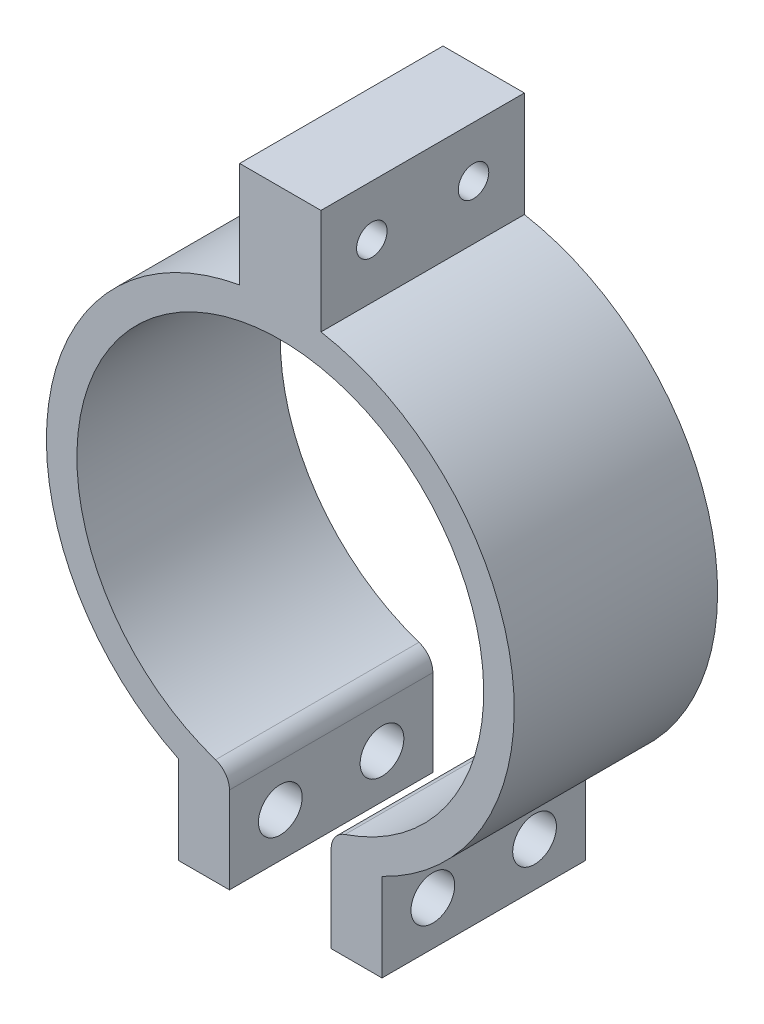
ISO-10303-21;
HEADER;
FILE_DESCRIPTION(('STEP AP214'),'2;1');
FILE_NAME('part.step','',(''),(''),'','','');
FILE_SCHEMA(('AUTOMOTIVE_DESIGN { 1 0 10303 214 1 1 1 1 }'));
ENDSEC;
DATA;
#1=APPLICATION_CONTEXT('core data for automotive mechanical design processes');
#2=APPLICATION_PROTOCOL_DEFINITION('international standard','automotive_design',2000,#1);
#3=PRODUCT_CONTEXT('',#1,'mechanical');
#4=PRODUCT('Part','Part','',(#3));
#5=PRODUCT_RELATED_PRODUCT_CATEGORY('part','',(#4));
#6=PRODUCT_DEFINITION_FORMATION('','',#4);
#7=PRODUCT_DEFINITION_CONTEXT('part definition',#1,'design');
#8=PRODUCT_DEFINITION('design','',#6,#7);
#9=PRODUCT_DEFINITION_SHAPE('','',#8);
#10=(LENGTH_UNIT() NAMED_UNIT(*) SI_UNIT(.MILLI.,.METRE.));
#11=(NAMED_UNIT(*) PLANE_ANGLE_UNIT() SI_UNIT($,.RADIAN.));
#12=(NAMED_UNIT(*) SI_UNIT($,.STERADIAN.) SOLID_ANGLE_UNIT());
#13=UNCERTAINTY_MEASURE_WITH_UNIT(LENGTH_MEASURE(1.E-05),#10,'distance_accuracy_value','');
#14=(GEOMETRIC_REPRESENTATION_CONTEXT(3) GLOBAL_UNCERTAINTY_ASSIGNED_CONTEXT((#13)) GLOBAL_UNIT_ASSIGNED_CONTEXT((#10,
#11,#12)) REPRESENTATION_CONTEXT('',''));
#15=CARTESIAN_POINT('',(0.,0.,0.));
#16=DIRECTION('',(0.,0.,1.));
#17=DIRECTION('',(1.,0.,0.));
#18=AXIS2_PLACEMENT_3D('',#15,#16,#17);
#19=CARTESIAN_POINT('',(0.,0.,20.));
#20=DIRECTION('',(0.,0.,-1.));
#21=DIRECTION('',(-1.,0.,0.));
#22=AXIS2_PLACEMENT_3D('',#19,#20,#21);
#23=CYLINDRICAL_SURFACE('',#22,23.);
#24=CARTESIAN_POINT('',(0.,0.,0.));
#25=DIRECTION('',(0.,0.,1.));
#26=DIRECTION('',(1.,0.,0.));
#27=AXIS2_PLACEMENT_3D('',#24,#25,#26);
#28=CIRCLE('',#27,23.);
#29=CARTESIAN_POINT('',(10.,-20.712315177208,0.));
#30=VERTEX_POINT('',#29);
#31=CARTESIAN_POINT('',(4.,22.6495033058122,0.));
#32=VERTEX_POINT('',#31);
#33=EDGE_CURVE('E50',#30,#32,#28,.T.);
#34=ORIENTED_EDGE('',*,*,#33,.T.);
#35=DIRECTION('',(0.,0.,-1.));
#36=VECTOR('',#35,1.);
#37=CARTESIAN_POINT('',(4.,22.6495033058122,20.));
#38=LINE('',#37,#36);
#39=CARTESIAN_POINT('',(4.,22.6495033058122,20.));
#40=VERTEX_POINT('',#39);
#41=EDGE_CURVE('E11',#32,#40,#38,.F.);
#42=ORIENTED_EDGE('',*,*,#41,.T.);
#43=CARTESIAN_POINT('',(0.,0.,20.));
#44=DIRECTION('',(0.,0.,1.));
#45=DIRECTION('',(1.,0.,0.));
#46=AXIS2_PLACEMENT_3D('',#43,#44,#45);
#47=CIRCLE('',#46,23.);
#48=CARTESIAN_POINT('',(10.,-20.712315177208,20.));
#49=VERTEX_POINT('',#48);
#50=EDGE_CURVE('E242',#49,#40,#47,.T.);
#51=ORIENTED_EDGE('',*,*,#50,.F.);
#52=DIRECTION('',(0.,0.,-1.));
#53=VECTOR('',#52,1.);
#54=CARTESIAN_POINT('',(10.,-20.712315177208,20.));
#55=LINE('',#54,#53);
#56=EDGE_CURVE('E247',#49,#30,#55,.T.);
#57=ORIENTED_EDGE('',*,*,#56,.T.);
#58=EDGE_LOOP('',(#34,#42,#51,#57));
#59=FACE_BOUND('',#58,.T.);
#60=ADVANCED_FACE('F34',(#59),#23,.T.);
#61=CARTESIAN_POINT('',(0.,0.,20.));
#62=DIRECTION('',(0.,0.,1.));
#63=DIRECTION('',(1.,0.,0.));
#64=AXIS2_PLACEMENT_3D('',#61,#62,#63);
#65=PLANE('',#64);
#66=ORIENTED_EDGE('',*,*,#50,.T.);
#67=DIRECTION('',(0.,-1.,0.));
#68=VECTOR('',#67,1.);
#69=CARTESIAN_POINT('',(4.,33.,20.));
#70=LINE('',#69,#68);
#71=CARTESIAN_POINT('',(4.,33.,20.));
#72=VERTEX_POINT('',#71);
#73=EDGE_CURVE('E147',#72,#40,#70,.T.);
#74=ORIENTED_EDGE('',*,*,#73,.F.);
#75=DIRECTION('',(1.,0.,0.));
#76=VECTOR('',#75,1.);
#77=CARTESIAN_POINT('',(-4.,33.,20.));
#78=LINE('',#77,#76);
#79=CARTESIAN_POINT('',(-4.,33.,20.));
#80=VERTEX_POINT('',#79);
#81=EDGE_CURVE('E146',#80,#72,#78,.T.);
#82=ORIENTED_EDGE('',*,*,#81,.F.);
#83=DIRECTION('',(0.,1.,0.));
#84=VECTOR('',#83,1.);
#85=CARTESIAN_POINT('',(-4.,33.,20.));
#86=LINE('',#85,#84);
#87=CARTESIAN_POINT('',(-4.,22.6495033058122,20.));
#88=VERTEX_POINT('',#87);
#89=EDGE_CURVE('E138',#88,#80,#86,.T.);
#90=ORIENTED_EDGE('',*,*,#89,.F.);
#91=CARTESIAN_POINT('',(-10.,-20.712315177208,20.));
#92=VERTEX_POINT('',#91);
#93=EDGE_CURVE('E58',#88,#92,#47,.T.);
#94=ORIENTED_EDGE('',*,*,#93,.T.);
#95=DIRECTION('',(0.,-1.,0.));
#96=VECTOR('',#95,1.);
#97=CARTESIAN_POINT('',(-10.,-19.3649167310371,20.));
#98=LINE('',#97,#96);
#99=CARTESIAN_POINT('',(-10.,-29.3649167310371,20.));
#100=VERTEX_POINT('',#99);
#101=EDGE_CURVE('E207',#92,#100,#98,.T.);
#102=ORIENTED_EDGE('',*,*,#101,.T.);
#103=DIRECTION('',(1.,0.,0.));
#104=VECTOR('',#103,1.);
#105=CARTESIAN_POINT('',(-5.,-29.3649167310371,20.));
#106=LINE('',#105,#104);
#107=CARTESIAN_POINT('',(-5.,-29.3649167310371,20.));
#108=VERTEX_POINT('',#107);
#109=EDGE_CURVE('E213',#100,#108,#106,.T.);
#110=ORIENTED_EDGE('',*,*,#109,.T.);
#111=DIRECTION('',(0.,-1.,0.));
#112=VECTOR('',#111,1.);
#113=CARTESIAN_POINT('',(-5.,-10.1845450867518,20.));
#114=LINE('',#113,#112);
#115=CARTESIAN_POINT('',(-5.,-20.8566536146142,20.));
#116=VERTEX_POINT('',#115);
#117=EDGE_CURVE('E223',#116,#108,#114,.T.);
#118=ORIENTED_EDGE('',*,*,#117,.F.);
#119=CARTESIAN_POINT('',(-7.,-20.8566536146142,20.));
#120=DIRECTION('',(0.,0.,1.));
#121=DIRECTION('',(1.,0.,0.));
#122=AXIS2_PLACEMENT_3D('',#119,#120,#121);
#123=CIRCLE('',#122,2.);
#124=CARTESIAN_POINT('',(-6.36363636363636,-18.9605941951038,20.));
#125=VERTEX_POINT('',#124);
#126=EDGE_CURVE('E254',#116,#125,#123,.T.);
#127=ORIENTED_EDGE('',*,*,#126,.T.);
#128=CARTESIAN_POINT('',(0.,0.,20.));
#129=DIRECTION('',(0.,0.,1.));
#130=DIRECTION('',(1.,0.,0.));
#131=AXIS2_PLACEMENT_3D('',#128,#129,#130);
#132=CIRCLE('',#131,20.);
#133=CARTESIAN_POINT('',(6.36363636363637,-18.9605941951038,20.));
#134=VERTEX_POINT('',#133);
#135=EDGE_CURVE('E236',#134,#125,#132,.T.);
#136=ORIENTED_EDGE('',*,*,#135,.F.);
#137=CARTESIAN_POINT('',(7.,-20.8566536146142,20.));
#138=DIRECTION('',(0.,0.,1.));
#139=DIRECTION('',(1.,0.,0.));
#140=AXIS2_PLACEMENT_3D('',#137,#138,#139);
#141=CIRCLE('',#140,2.);
#142=CARTESIAN_POINT('',(5.,-20.8566536146142,20.));
#143=VERTEX_POINT('',#142);
#144=EDGE_CURVE('E252',#134,#143,#141,.T.);
#145=ORIENTED_EDGE('',*,*,#144,.T.);
#146=DIRECTION('',(0.,1.,0.));
#147=VECTOR('',#146,1.);
#148=CARTESIAN_POINT('',(5.,-10.1845450867518,20.));
#149=LINE('',#148,#147);
#150=CARTESIAN_POINT('',(5.,-29.3649167310371,20.));
#151=VERTEX_POINT('',#150);
#152=EDGE_CURVE('E229',#151,#143,#149,.T.);
#153=ORIENTED_EDGE('',*,*,#152,.F.);
#154=DIRECTION('',(1.,0.,0.));
#155=VECTOR('',#154,1.);
#156=CARTESIAN_POINT('',(5.,-29.3649167310371,20.));
#157=LINE('',#156,#155);
#158=CARTESIAN_POINT('',(10.,-29.3649167310371,20.));
#159=VERTEX_POINT('',#158);
#160=EDGE_CURVE('E194',#151,#159,#157,.T.);
#161=ORIENTED_EDGE('',*,*,#160,.T.);
#162=DIRECTION('',(0.,1.,0.));
#163=VECTOR('',#162,1.);
#164=CARTESIAN_POINT('',(10.,-19.3649167310371,20.));
#165=LINE('',#164,#163);
#166=EDGE_CURVE('E199',#159,#49,#165,.T.);
#167=ORIENTED_EDGE('',*,*,#166,.T.);
#168=EDGE_LOOP('',(#66,#74,#82,#90,#94,#102,#110,#118,#127,#136,#145,#153,#161,#167));
#169=FACE_BOUND('',#168,.T.);
#170=ADVANCED_FACE('F158',(#169),#65,.T.);
#171=CARTESIAN_POINT('',(0.,0.,0.));
#172=DIRECTION('',(0.,0.,1.));
#173=DIRECTION('',(1.,0.,0.));
#174=AXIS2_PLACEMENT_3D('',#171,#172,#173);
#175=PLANE('',#174);
#176=DIRECTION('',(0.,-1.,0.));
#177=VECTOR('',#176,1.);
#178=CARTESIAN_POINT('',(4.,33.,0.));
#179=LINE('',#178,#177);
#180=CARTESIAN_POINT('',(4.,33.,0.));
#181=VERTEX_POINT('',#180);
#182=EDGE_CURVE('E163',#181,#32,#179,.T.);
#183=ORIENTED_EDGE('',*,*,#182,.T.);
#184=ORIENTED_EDGE('',*,*,#33,.F.);
#185=DIRECTION('',(0.,1.,0.));
#186=VECTOR('',#185,1.);
#187=CARTESIAN_POINT('',(10.,-19.3649167310371,0.));
#188=LINE('',#187,#186);
#189=CARTESIAN_POINT('',(10.,-29.3649167310371,0.));
#190=VERTEX_POINT('',#189);
#191=EDGE_CURVE('E198',#190,#30,#188,.T.);
#192=ORIENTED_EDGE('',*,*,#191,.F.);
#193=DIRECTION('',(1.,0.,0.));
#194=VECTOR('',#193,1.);
#195=CARTESIAN_POINT('',(5.,-29.3649167310371,0.));
#196=LINE('',#195,#194);
#197=CARTESIAN_POINT('',(5.,-29.3649167310371,0.));
#198=VERTEX_POINT('',#197);
#199=EDGE_CURVE('E195',#198,#190,#196,.T.);
#200=ORIENTED_EDGE('',*,*,#199,.F.);
#201=DIRECTION('',(0.,1.,0.));
#202=VECTOR('',#201,1.);
#203=CARTESIAN_POINT('',(5.,-10.1845450867518,0.));
#204=LINE('',#203,#202);
#205=CARTESIAN_POINT('',(5.,-20.8566536146142,0.));
#206=VERTEX_POINT('',#205);
#207=EDGE_CURVE('E228',#198,#206,#204,.T.);
#208=ORIENTED_EDGE('',*,*,#207,.T.);
#209=CARTESIAN_POINT('',(7.,-20.8566536146142,0.));
#210=DIRECTION('',(0.,0.,1.));
#211=DIRECTION('',(1.,0.,0.));
#212=AXIS2_PLACEMENT_3D('',#209,#210,#211);
#213=CIRCLE('',#212,2.);
#214=CARTESIAN_POINT('',(6.36363636363637,-18.9605941951038,0.));
#215=VERTEX_POINT('',#214);
#216=EDGE_CURVE('E260',#206,#215,#213,.F.);
#217=ORIENTED_EDGE('',*,*,#216,.T.);
#218=CARTESIAN_POINT('',(0.,0.,0.));
#219=DIRECTION('',(0.,0.,1.));
#220=DIRECTION('',(1.,0.,0.));
#221=AXIS2_PLACEMENT_3D('',#218,#219,#220);
#222=CIRCLE('',#221,20.);
#223=CARTESIAN_POINT('',(-6.36363636363636,-18.9605941951038,0.));
#224=VERTEX_POINT('',#223);
#225=EDGE_CURVE('E232',#215,#224,#222,.T.);
#226=ORIENTED_EDGE('',*,*,#225,.T.);
#227=CARTESIAN_POINT('',(-7.,-20.8566536146142,0.));
#228=DIRECTION('',(0.,0.,1.));
#229=DIRECTION('',(1.,0.,0.));
#230=AXIS2_PLACEMENT_3D('',#227,#228,#229);
#231=CIRCLE('',#230,2.);
#232=CARTESIAN_POINT('',(-5.,-20.8566536146142,0.));
#233=VERTEX_POINT('',#232);
#234=EDGE_CURVE('E262',#224,#233,#231,.F.);
#235=ORIENTED_EDGE('',*,*,#234,.T.);
#236=DIRECTION('',(0.,-1.,0.));
#237=VECTOR('',#236,1.);
#238=CARTESIAN_POINT('',(-5.,-10.1845450867518,0.));
#239=LINE('',#238,#237);
#240=CARTESIAN_POINT('',(-5.,-29.3649167310371,0.));
#241=VERTEX_POINT('',#240);
#242=EDGE_CURVE('E226',#233,#241,#239,.T.);
#243=ORIENTED_EDGE('',*,*,#242,.T.);
#244=DIRECTION('',(1.,0.,0.));
#245=VECTOR('',#244,1.);
#246=CARTESIAN_POINT('',(-5.,-29.3649167310371,0.));
#247=LINE('',#246,#245);
#248=CARTESIAN_POINT('',(-10.,-29.3649167310371,0.));
#249=VERTEX_POINT('',#248);
#250=EDGE_CURVE('E212',#249,#241,#247,.T.);
#251=ORIENTED_EDGE('',*,*,#250,.F.);
#252=DIRECTION('',(0.,-1.,0.));
#253=VECTOR('',#252,1.);
#254=CARTESIAN_POINT('',(-10.,-19.3649167310371,0.));
#255=LINE('',#254,#253);
#256=CARTESIAN_POINT('',(-10.,-20.712315177208,0.));
#257=VERTEX_POINT('',#256);
#258=EDGE_CURVE('E210',#257,#249,#255,.T.);
#259=ORIENTED_EDGE('',*,*,#258,.F.);
#260=CARTESIAN_POINT('',(-4.,22.6495033058122,0.));
#261=VERTEX_POINT('',#260);
#262=EDGE_CURVE('E239',#261,#257,#28,.T.);
#263=ORIENTED_EDGE('',*,*,#262,.F.);
#264=DIRECTION('',(0.,1.,0.));
#265=VECTOR('',#264,1.);
#266=CARTESIAN_POINT('',(-4.,33.,0.));
#267=LINE('',#266,#265);
#268=CARTESIAN_POINT('',(-4.,33.,0.));
#269=VERTEX_POINT('',#268);
#270=EDGE_CURVE('E166',#261,#269,#267,.T.);
#271=ORIENTED_EDGE('',*,*,#270,.T.);
#272=DIRECTION('',(1.,0.,0.));
#273=VECTOR('',#272,1.);
#274=CARTESIAN_POINT('',(-4.,33.,0.));
#275=LINE('',#274,#273);
#276=EDGE_CURVE('E153',#269,#181,#275,.T.);
#277=ORIENTED_EDGE('',*,*,#276,.T.);
#278=EDGE_LOOP('',(#183,#184,#192,#200,#208,#217,#226,#235,#243,#251,#259,#263,#271,#277));
#279=FACE_BOUND('',#278,.T.);
#280=ADVANCED_FACE('F284',(#279),#175,.F.);
#281=ORIENTED_EDGE('',*,*,#93,.F.);
#282=DIRECTION('',(0.,0.,-1.));
#283=VECTOR('',#282,1.);
#284=CARTESIAN_POINT('',(-4.,22.6495033058122,20.));
#285=LINE('',#284,#283);
#286=EDGE_CURVE('E43',#88,#261,#285,.T.);
#287=ORIENTED_EDGE('',*,*,#286,.T.);
#288=ORIENTED_EDGE('',*,*,#262,.T.);
#289=DIRECTION('',(0.,0.,-1.));
#290=VECTOR('',#289,1.);
#291=CARTESIAN_POINT('',(-10.,-20.712315177208,20.));
#292=LINE('',#291,#290);
#293=EDGE_CURVE('E244',#257,#92,#292,.F.);
#294=ORIENTED_EDGE('',*,*,#293,.T.);
#295=EDGE_LOOP('',(#281,#287,#288,#294));
#296=FACE_BOUND('',#295,.T.);
#297=ADVANCED_FACE('F288',(#296),#23,.T.);
#298=CARTESIAN_POINT('',(0.,0.,20.));
#299=DIRECTION('',(0.,0.,-1.));
#300=DIRECTION('',(-1.,0.,0.));
#301=AXIS2_PLACEMENT_3D('',#298,#299,#300);
#302=CYLINDRICAL_SURFACE('',#301,20.);
#303=ORIENTED_EDGE('',*,*,#135,.T.);
#304=DIRECTION('',(0.,0.,-1.));
#305=VECTOR('',#304,1.);
#306=CARTESIAN_POINT('',(-6.36363636363636,-18.9605941951038,20.));
#307=LINE('',#306,#305);
#308=EDGE_CURVE('E258',#125,#224,#307,.T.);
#309=ORIENTED_EDGE('',*,*,#308,.T.);
#310=ORIENTED_EDGE('',*,*,#225,.F.);
#311=DIRECTION('',(0.,0.,-1.));
#312=VECTOR('',#311,1.);
#313=CARTESIAN_POINT('',(6.36363636363637,-18.9605941951038,20.));
#314=LINE('',#313,#312);
#315=EDGE_CURVE('E256',#215,#134,#314,.F.);
#316=ORIENTED_EDGE('',*,*,#315,.T.);
#317=EDGE_LOOP('',(#303,#309,#310,#316));
#318=FACE_BOUND('',#317,.T.);
#319=ADVANCED_FACE('F290',(#318),#302,.F.);
#320=CARTESIAN_POINT('',(5.,-10.1845450867518,0.));
#321=DIRECTION('',(1.,0.,0.));
#322=DIRECTION('',(0.,1.,0.));
#323=AXIS2_PLACEMENT_3D('',#320,#321,#322);
#324=PLANE('',#323);
#325=CARTESIAN_POINT('',(5.,-25.0386159541225,15.));
#326=DIRECTION('',(1.,0.,0.));
#327=DIRECTION('',(0.,1.,0.));
#328=AXIS2_PLACEMENT_3D('',#325,#326,#327);
#329=CIRCLE('',#328,2.15);
#330=CARTESIAN_POINT('',(5.,-22.8886159541225,15.));
#331=VERTEX_POINT('',#330);
#332=EDGE_CURVE('E191',#331,#331,#329,.T.);
#333=ORIENTED_EDGE('',*,*,#332,.T.);
#334=EDGE_LOOP('',(#333));
#335=FACE_BOUND('',#334,.T.);
#336=CARTESIAN_POINT('',(5.,-25.0386159541225,5.));
#337=DIRECTION('',(1.,0.,0.));
#338=DIRECTION('',(0.,1.,0.));
#339=AXIS2_PLACEMENT_3D('',#336,#337,#338);
#340=CIRCLE('',#339,2.15);
#341=CARTESIAN_POINT('',(5.,-22.8886159541225,5.));
#342=VERTEX_POINT('',#341);
#343=EDGE_CURVE('E185',#342,#342,#340,.T.);
#344=ORIENTED_EDGE('',*,*,#343,.T.);
#345=EDGE_LOOP('',(#344));
#346=FACE_BOUND('',#345,.T.);
#347=ORIENTED_EDGE('',*,*,#152,.T.);
#348=DIRECTION('',(0.,0.,1.));
#349=VECTOR('',#348,1.);
#350=CARTESIAN_POINT('',(5.,-20.8566536146142,0.));
#351=LINE('',#350,#349);
#352=EDGE_CURVE('E264',#143,#206,#351,.F.);
#353=ORIENTED_EDGE('',*,*,#352,.T.);
#354=ORIENTED_EDGE('',*,*,#207,.F.);
#355=DIRECTION('',(0.,0.,1.));
#356=VECTOR('',#355,1.);
#357=CARTESIAN_POINT('',(5.,-29.3649167310371,0.));
#358=LINE('',#357,#356);
#359=EDGE_CURVE('E201',#198,#151,#358,.T.);
#360=ORIENTED_EDGE('',*,*,#359,.T.);
#361=EDGE_LOOP('',(#347,#353,#354,#360));
#362=FACE_BOUND('',#361,.T.);
#363=ADVANCED_FACE('F296',(#335,#346,#362),#324,.F.);
#364=CARTESIAN_POINT('',(-5.,-10.1845450867518,0.));
#365=DIRECTION('',(-1.,0.,0.));
#366=DIRECTION('',(0.,-1.,0.));
#367=AXIS2_PLACEMENT_3D('',#364,#365,#366);
#368=PLANE('',#367);
#369=CARTESIAN_POINT('',(-5.,-25.0386159541225,15.));
#370=DIRECTION('',(-1.,0.,0.));
#371=DIRECTION('',(0.,-1.,0.));
#372=AXIS2_PLACEMENT_3D('',#369,#370,#371);
#373=CIRCLE('',#372,2.15);
#374=CARTESIAN_POINT('',(-5.,-27.1886159541225,15.));
#375=VERTEX_POINT('',#374);
#376=EDGE_CURVE('E188',#375,#375,#373,.T.);
#377=ORIENTED_EDGE('',*,*,#376,.T.);
#378=EDGE_LOOP('',(#377));
#379=FACE_BOUND('',#378,.T.);
#380=CARTESIAN_POINT('',(-5.,-25.0386159541225,5.));
#381=DIRECTION('',(-1.,0.,0.));
#382=DIRECTION('',(0.,-1.,0.));
#383=AXIS2_PLACEMENT_3D('',#380,#381,#382);
#384=CIRCLE('',#383,2.15);
#385=CARTESIAN_POINT('',(-5.,-27.1886159541225,5.));
#386=VERTEX_POINT('',#385);
#387=EDGE_CURVE('E174',#386,#386,#384,.T.);
#388=ORIENTED_EDGE('',*,*,#387,.T.);
#389=EDGE_LOOP('',(#388));
#390=FACE_BOUND('',#389,.T.);
#391=ORIENTED_EDGE('',*,*,#242,.F.);
#392=DIRECTION('',(0.,0.,1.));
#393=VECTOR('',#392,1.);
#394=CARTESIAN_POINT('',(-5.,-20.8566536146142,20.));
#395=LINE('',#394,#393);
#396=EDGE_CURVE('E249',#233,#116,#395,.T.);
#397=ORIENTED_EDGE('',*,*,#396,.T.);
#398=ORIENTED_EDGE('',*,*,#117,.T.);
#399=DIRECTION('',(0.,0.,1.));
#400=VECTOR('',#399,1.);
#401=CARTESIAN_POINT('',(-5.,-29.3649167310371,0.));
#402=LINE('',#401,#400);
#403=EDGE_CURVE('E220',#241,#108,#402,.T.);
#404=ORIENTED_EDGE('',*,*,#403,.F.);
#405=EDGE_LOOP('',(#391,#397,#398,#404));
#406=FACE_BOUND('',#405,.T.);
#407=ADVANCED_FACE('F308',(#379,#390,#406),#368,.F.);
#408=CARTESIAN_POINT('',(-10.,-19.3649167310371,0.));
#409=DIRECTION('',(-1.,0.,0.));
#410=DIRECTION('',(0.,-1.,0.));
#411=AXIS2_PLACEMENT_3D('',#408,#409,#410);
#412=PLANE('',#411);
#413=CARTESIAN_POINT('',(-10.,-25.0386159541225,15.));
#414=DIRECTION('',(1.,0.,0.));
#415=DIRECTION('',(0.,1.,0.));
#416=AXIS2_PLACEMENT_3D('',#413,#414,#415);
#417=CIRCLE('',#416,2.15);
#418=CARTESIAN_POINT('',(-10.,-22.8886159541225,15.));
#419=VERTEX_POINT('',#418);
#420=EDGE_CURVE('E171',#419,#419,#417,.T.);
#421=ORIENTED_EDGE('',*,*,#420,.T.);
#422=EDGE_LOOP('',(#421));
#423=FACE_BOUND('',#422,.T.);
#424=CARTESIAN_POINT('',(-10.,-25.0386159541225,5.));
#425=DIRECTION('',(1.,0.,0.));
#426=DIRECTION('',(0.,1.,0.));
#427=AXIS2_PLACEMENT_3D('',#424,#425,#426);
#428=CIRCLE('',#427,2.15);
#429=CARTESIAN_POINT('',(-10.,-22.8886159541225,5.));
#430=VERTEX_POINT('',#429);
#431=EDGE_CURVE('E178',#430,#430,#428,.T.);
#432=ORIENTED_EDGE('',*,*,#431,.T.);
#433=EDGE_LOOP('',(#432));
#434=FACE_BOUND('',#433,.T.);
#435=ORIENTED_EDGE('',*,*,#293,.F.);
#436=ORIENTED_EDGE('',*,*,#258,.T.);
#437=DIRECTION('',(0.,0.,1.));
#438=VECTOR('',#437,1.);
#439=CARTESIAN_POINT('',(-10.,-29.3649167310371,0.));
#440=LINE('',#439,#438);
#441=EDGE_CURVE('E216',#249,#100,#440,.T.);
#442=ORIENTED_EDGE('',*,*,#441,.T.);
#443=ORIENTED_EDGE('',*,*,#101,.F.);
#444=EDGE_LOOP('',(#435,#436,#442,#443));
#445=FACE_BOUND('',#444,.T.);
#446=ADVANCED_FACE('F311',(#423,#434,#445),#412,.T.);
#447=CARTESIAN_POINT('',(-5.,-29.3649167310371,0.));
#448=DIRECTION('',(0.,-1.,0.));
#449=DIRECTION('',(0.,0.,-1.));
#450=AXIS2_PLACEMENT_3D('',#447,#448,#449);
#451=PLANE('',#450);
#452=ORIENTED_EDGE('',*,*,#109,.F.);
#453=ORIENTED_EDGE('',*,*,#441,.F.);
#454=ORIENTED_EDGE('',*,*,#250,.T.);
#455=ORIENTED_EDGE('',*,*,#403,.T.);
#456=EDGE_LOOP('',(#452,#453,#454,#455));
#457=FACE_BOUND('',#456,.T.);
#458=ADVANCED_FACE('F318',(#457),#451,.T.);
#459=CARTESIAN_POINT('',(10.,-19.3649167310371,0.));
#460=DIRECTION('',(1.,0.,0.));
#461=DIRECTION('',(0.,1.,0.));
#462=AXIS2_PLACEMENT_3D('',#459,#460,#461);
#463=PLANE('',#462);
#464=CARTESIAN_POINT('',(10.,-25.0386159541225,15.));
#465=DIRECTION('',(1.,0.,0.));
#466=DIRECTION('',(0.,1.,0.));
#467=AXIS2_PLACEMENT_3D('',#464,#465,#466);
#468=CIRCLE('',#467,2.15);
#469=CARTESIAN_POINT('',(10.,-22.8886159541225,15.));
#470=VERTEX_POINT('',#469);
#471=EDGE_CURVE('E175',#470,#470,#468,.T.);
#472=ORIENTED_EDGE('',*,*,#471,.F.);
#473=EDGE_LOOP('',(#472));
#474=FACE_BOUND('',#473,.T.);
#475=CARTESIAN_POINT('',(10.,-25.0386159541225,5.));
#476=DIRECTION('',(1.,0.,0.));
#477=DIRECTION('',(0.,1.,0.));
#478=AXIS2_PLACEMENT_3D('',#475,#476,#477);
#479=CIRCLE('',#478,2.15);
#480=CARTESIAN_POINT('',(10.,-22.8886159541225,5.));
#481=VERTEX_POINT('',#480);
#482=EDGE_CURVE('E169',#481,#481,#479,.T.);
#483=ORIENTED_EDGE('',*,*,#482,.F.);
#484=EDGE_LOOP('',(#483));
#485=FACE_BOUND('',#484,.T.);
#486=ORIENTED_EDGE('',*,*,#56,.F.);
#487=ORIENTED_EDGE('',*,*,#166,.F.);
#488=DIRECTION('',(0.,0.,1.));
#489=VECTOR('',#488,1.);
#490=CARTESIAN_POINT('',(10.,-29.3649167310371,0.));
#491=LINE('',#490,#489);
#492=EDGE_CURVE('E205',#190,#159,#491,.T.);
#493=ORIENTED_EDGE('',*,*,#492,.F.);
#494=ORIENTED_EDGE('',*,*,#191,.T.);
#495=EDGE_LOOP('',(#486,#487,#493,#494));
#496=FACE_BOUND('',#495,.T.);
#497=ADVANCED_FACE('F322',(#474,#485,#496),#463,.T.);
#498=CARTESIAN_POINT('',(5.,-29.3649167310371,0.));
#499=DIRECTION('',(0.,-1.,0.));
#500=DIRECTION('',(0.,0.,-1.));
#501=AXIS2_PLACEMENT_3D('',#498,#499,#500);
#502=PLANE('',#501);
#503=ORIENTED_EDGE('',*,*,#160,.F.);
#504=ORIENTED_EDGE('',*,*,#359,.F.);
#505=ORIENTED_EDGE('',*,*,#199,.T.);
#506=ORIENTED_EDGE('',*,*,#492,.T.);
#507=EDGE_LOOP('',(#503,#504,#505,#506));
#508=FACE_BOUND('',#507,.T.);
#509=ADVANCED_FACE('F324',(#508),#502,.T.);
#510=CARTESIAN_POINT('',(-7.,-20.8566536146142,20.));
#511=DIRECTION('',(0.,0.,-1.));
#512=DIRECTION('',(-1.,0.,0.));
#513=AXIS2_PLACEMENT_3D('',#510,#511,#512);
#514=CYLINDRICAL_SURFACE('',#513,2.);
#515=ORIENTED_EDGE('',*,*,#234,.F.);
#516=ORIENTED_EDGE('',*,*,#308,.F.);
#517=ORIENTED_EDGE('',*,*,#126,.F.);
#518=ORIENTED_EDGE('',*,*,#396,.F.);
#519=EDGE_LOOP('',(#515,#516,#517,#518));
#520=FACE_BOUND('',#519,.T.);
#521=ADVANCED_FACE('F327',(#520),#514,.T.);
#522=CARTESIAN_POINT('',(7.,-20.8566536146142,20.));
#523=DIRECTION('',(0.,0.,-1.));
#524=DIRECTION('',(-1.,0.,0.));
#525=AXIS2_PLACEMENT_3D('',#522,#523,#524);
#526=CYLINDRICAL_SURFACE('',#525,2.);
#527=ORIENTED_EDGE('',*,*,#144,.F.);
#528=ORIENTED_EDGE('',*,*,#315,.F.);
#529=ORIENTED_EDGE('',*,*,#216,.F.);
#530=ORIENTED_EDGE('',*,*,#352,.F.);
#531=EDGE_LOOP('',(#527,#528,#529,#530));
#532=FACE_BOUND('',#531,.T.);
#533=ADVANCED_FACE('F36',(#532),#526,.T.);
#534=CARTESIAN_POINT('',(-10.,-25.0386159541225,5.));
#535=DIRECTION('',(1.,0.,0.));
#536=DIRECTION('',(0.,1.,0.));
#537=AXIS2_PLACEMENT_3D('',#534,#535,#536);
#538=CYLINDRICAL_SURFACE('',#537,2.15);
#539=ORIENTED_EDGE('',*,*,#482,.T.);
#540=EDGE_LOOP('',(#539));
#541=FACE_BOUND('',#540,.T.);
#542=ORIENTED_EDGE('',*,*,#343,.F.);
#543=EDGE_LOOP('',(#542));
#544=FACE_BOUND('',#543,.T.);
#545=ADVANCED_FACE('F332',(#541,#544),#538,.F.);
#546=CARTESIAN_POINT('',(-10.,-25.0386159541225,15.));
#547=DIRECTION('',(1.,0.,0.));
#548=DIRECTION('',(0.,1.,0.));
#549=AXIS2_PLACEMENT_3D('',#546,#547,#548);
#550=CYLINDRICAL_SURFACE('',#549,2.15);
#551=ORIENTED_EDGE('',*,*,#471,.T.);
#552=EDGE_LOOP('',(#551));
#553=FACE_BOUND('',#552,.T.);
#554=ORIENTED_EDGE('',*,*,#332,.F.);
#555=EDGE_LOOP('',(#554));
#556=FACE_BOUND('',#555,.T.);
#557=ADVANCED_FACE('F335',(#553,#556),#550,.F.);
#558=ORIENTED_EDGE('',*,*,#431,.F.);
#559=EDGE_LOOP('',(#558));
#560=FACE_BOUND('',#559,.T.);
#561=ORIENTED_EDGE('',*,*,#387,.F.);
#562=EDGE_LOOP('',(#561));
#563=FACE_BOUND('',#562,.T.);
#564=ADVANCED_FACE('F337',(#560,#563),#538,.F.);
#565=ORIENTED_EDGE('',*,*,#420,.F.);
#566=EDGE_LOOP('',(#565));
#567=FACE_BOUND('',#566,.T.);
#568=ORIENTED_EDGE('',*,*,#376,.F.);
#569=EDGE_LOOP('',(#568));
#570=FACE_BOUND('',#569,.T.);
#571=ADVANCED_FACE('F341',(#567,#570),#550,.F.);
#572=CARTESIAN_POINT('',(4.,33.,20.));
#573=DIRECTION('',(1.,0.,0.));
#574=DIRECTION('',(0.,1.,0.));
#575=AXIS2_PLACEMENT_3D('',#572,#573,#574);
#576=PLANE('',#575);
#577=CARTESIAN_POINT('',(4.,28.,5.));
#578=DIRECTION('',(1.,0.,0.));
#579=DIRECTION('',(0.,1.,0.));
#580=AXIS2_PLACEMENT_3D('',#577,#578,#579);
#581=CIRCLE('',#580,1.5);
#582=CARTESIAN_POINT('',(4.,29.5,5.));
#583=VERTEX_POINT('',#582);
#584=EDGE_CURVE('E269',#583,#583,#581,.T.);
#585=ORIENTED_EDGE('',*,*,#584,.F.);
#586=EDGE_LOOP('',(#585));
#587=FACE_BOUND('',#586,.T.);
#588=CARTESIAN_POINT('',(4.,28.,15.));
#589=DIRECTION('',(1.,0.,0.));
#590=DIRECTION('',(0.,1.,0.));
#591=AXIS2_PLACEMENT_3D('',#588,#589,#590);
#592=CIRCLE('',#591,1.5);
#593=CARTESIAN_POINT('',(4.,29.5,15.));
#594=VERTEX_POINT('',#593);
#595=EDGE_CURVE('E274',#594,#594,#592,.T.);
#596=ORIENTED_EDGE('',*,*,#595,.F.);
#597=EDGE_LOOP('',(#596));
#598=FACE_BOUND('',#597,.T.);
#599=ORIENTED_EDGE('',*,*,#41,.F.);
#600=ORIENTED_EDGE('',*,*,#182,.F.);
#601=DIRECTION('',(0.,0.,-1.));
#602=VECTOR('',#601,1.);
#603=CARTESIAN_POINT('',(4.,33.,20.));
#604=LINE('',#603,#602);
#605=EDGE_CURVE('E154',#72,#181,#604,.T.);
#606=ORIENTED_EDGE('',*,*,#605,.F.);
#607=ORIENTED_EDGE('',*,*,#73,.T.);
#608=EDGE_LOOP('',(#599,#600,#606,#607));
#609=FACE_BOUND('',#608,.T.);
#610=ADVANCED_FACE('F281',(#587,#598,#609),#576,.T.);
#611=CARTESIAN_POINT('',(-4.,33.,20.));
#612=DIRECTION('',(-1.,0.,0.));
#613=DIRECTION('',(0.,-1.,0.));
#614=AXIS2_PLACEMENT_3D('',#611,#612,#613);
#615=PLANE('',#614);
#616=CARTESIAN_POINT('',(-4.,28.,5.));
#617=DIRECTION('',(-1.,0.,0.));
#618=DIRECTION('',(0.,-1.,0.));
#619=AXIS2_PLACEMENT_3D('',#616,#617,#618);
#620=CIRCLE('',#619,1.5);
#621=CARTESIAN_POINT('',(-4.,26.5,5.));
#622=VERTEX_POINT('',#621);
#623=EDGE_CURVE('E38',#622,#622,#620,.T.);
#624=ORIENTED_EDGE('',*,*,#623,.F.);
#625=EDGE_LOOP('',(#624));
#626=FACE_BOUND('',#625,.T.);
#627=CARTESIAN_POINT('',(-4.,28.,15.));
#628=DIRECTION('',(-1.,0.,0.));
#629=DIRECTION('',(0.,-1.,0.));
#630=AXIS2_PLACEMENT_3D('',#627,#628,#629);
#631=CIRCLE('',#630,1.5);
#632=CARTESIAN_POINT('',(-4.,26.5,15.));
#633=VERTEX_POINT('',#632);
#634=EDGE_CURVE('E267',#633,#633,#631,.T.);
#635=ORIENTED_EDGE('',*,*,#634,.F.);
#636=EDGE_LOOP('',(#635));
#637=FACE_BOUND('',#636,.T.);
#638=ORIENTED_EDGE('',*,*,#286,.F.);
#639=ORIENTED_EDGE('',*,*,#89,.T.);
#640=DIRECTION('',(0.,0.,-1.));
#641=VECTOR('',#640,1.);
#642=CARTESIAN_POINT('',(-4.,33.,20.));
#643=LINE('',#642,#641);
#644=EDGE_CURVE('E142',#80,#269,#643,.T.);
#645=ORIENTED_EDGE('',*,*,#644,.T.);
#646=ORIENTED_EDGE('',*,*,#270,.F.);
#647=EDGE_LOOP('',(#638,#639,#645,#646));
#648=FACE_BOUND('',#647,.T.);
#649=ADVANCED_FACE('F140',(#626,#637,#648),#615,.T.);
#650=CARTESIAN_POINT('',(-4.,33.,20.));
#651=DIRECTION('',(0.,1.,0.));
#652=DIRECTION('',(0.,0.,1.));
#653=AXIS2_PLACEMENT_3D('',#650,#651,#652);
#654=PLANE('',#653);
#655=ORIENTED_EDGE('',*,*,#276,.F.);
#656=ORIENTED_EDGE('',*,*,#644,.F.);
#657=ORIENTED_EDGE('',*,*,#81,.T.);
#658=ORIENTED_EDGE('',*,*,#605,.T.);
#659=EDGE_LOOP('',(#655,#656,#657,#658));
#660=FACE_BOUND('',#659,.T.);
#661=ADVANCED_FACE('F151',(#660),#654,.T.);
#662=CARTESIAN_POINT('',(-19.,28.,15.));
#663=DIRECTION('',(1.,0.,0.));
#664=DIRECTION('',(0.,1.,0.));
#665=AXIS2_PLACEMENT_3D('',#662,#663,#664);
#666=CYLINDRICAL_SURFACE('',#665,1.5);
#667=ORIENTED_EDGE('',*,*,#634,.T.);
#668=EDGE_LOOP('',(#667));
#669=FACE_BOUND('',#668,.T.);
#670=ORIENTED_EDGE('',*,*,#595,.T.);
#671=EDGE_LOOP('',(#670));
#672=FACE_BOUND('',#671,.T.);
#673=ADVANCED_FACE('F350',(#669,#672),#666,.F.);
#674=CARTESIAN_POINT('',(-19.,28.,5.));
#675=DIRECTION('',(1.,0.,0.));
#676=DIRECTION('',(0.,1.,0.));
#677=AXIS2_PLACEMENT_3D('',#674,#675,#676);
#678=CYLINDRICAL_SURFACE('',#677,1.5);
#679=ORIENTED_EDGE('',*,*,#623,.T.);
#680=EDGE_LOOP('',(#679));
#681=FACE_BOUND('',#680,.T.);
#682=ORIENTED_EDGE('',*,*,#584,.T.);
#683=EDGE_LOOP('',(#682));
#684=FACE_BOUND('',#683,.T.);
#685=ADVANCED_FACE('F353',(#681,#684),#678,.F.);
#686=CLOSED_SHELL('',(#60,#170,#280,#297,#319,#363,#407,#446,#458,#497,#509,#521,#533,#545,#557,
#564,#571,#610,#649,#661,#673,#685));
#687=MANIFOLD_SOLID_BREP('B2',#686);
#688=ADVANCED_BREP_SHAPE_REPRESENTATION('',(#18,#687),#14);
#689=SHAPE_DEFINITION_REPRESENTATION(#9,#688);
ENDSEC;
END-ISO-10303-21;
